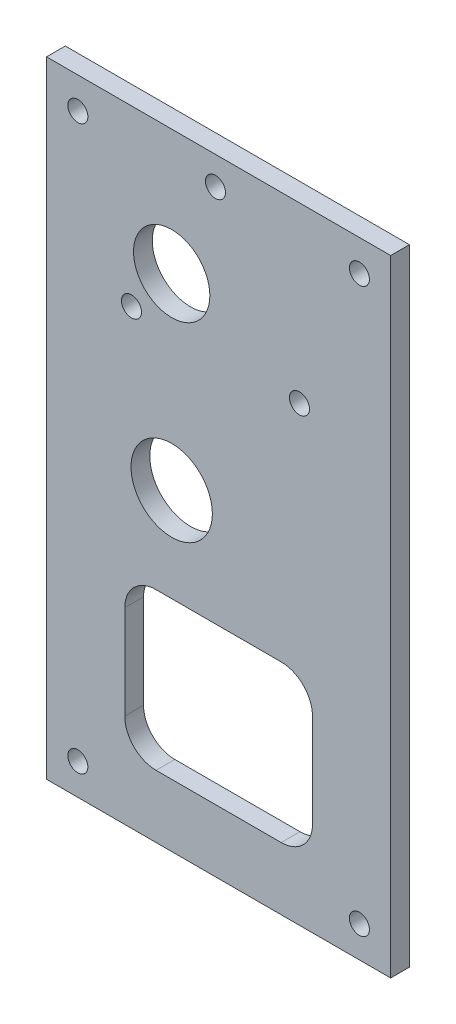
ISO-10303-21;
HEADER;
FILE_DESCRIPTION(('STEP AP214'),'2;1');
FILE_NAME('part.step','',(''),(''),'','','');
FILE_SCHEMA(('AUTOMOTIVE_DESIGN { 1 0 10303 214 1 1 1 1 }'));
ENDSEC;
DATA;
#1=APPLICATION_CONTEXT('core data for automotive mechanical design processes');
#2=APPLICATION_PROTOCOL_DEFINITION('international standard','automotive_design',2000,#1);
#3=PRODUCT_CONTEXT('',#1,'mechanical');
#4=PRODUCT('Part','Part','',(#3));
#5=PRODUCT_RELATED_PRODUCT_CATEGORY('part','',(#4));
#6=PRODUCT_DEFINITION_FORMATION('','',#4);
#7=PRODUCT_DEFINITION_CONTEXT('part definition',#1,'design');
#8=PRODUCT_DEFINITION('design','',#6,#7);
#9=PRODUCT_DEFINITION_SHAPE('','',#8);
#10=(LENGTH_UNIT() NAMED_UNIT(*) SI_UNIT(.MILLI.,.METRE.));
#11=(NAMED_UNIT(*) PLANE_ANGLE_UNIT() SI_UNIT($,.RADIAN.));
#12=(NAMED_UNIT(*) SI_UNIT($,.STERADIAN.) SOLID_ANGLE_UNIT());
#13=UNCERTAINTY_MEASURE_WITH_UNIT(LENGTH_MEASURE(1.E-05),#10,'distance_accuracy_value','');
#14=(GEOMETRIC_REPRESENTATION_CONTEXT(3) GLOBAL_UNCERTAINTY_ASSIGNED_CONTEXT((#13)) GLOBAL_UNIT_ASSIGNED_CONTEXT((#10,
#11,#12)) REPRESENTATION_CONTEXT('',''));
#15=CARTESIAN_POINT('',(0.,0.,0.));
#16=DIRECTION('',(0.,0.,1.));
#17=DIRECTION('',(1.,0.,0.));
#18=AXIS2_PLACEMENT_3D('',#15,#16,#17);
#19=CARTESIAN_POINT('',(27.5,50.,1.5));
#20=DIRECTION('',(-1.,0.,0.));
#21=DIRECTION('',(0.,-1.,0.));
#22=AXIS2_PLACEMENT_3D('',#19,#20,#21);
#23=PLANE('',#22);
#24=DIRECTION('',(0.,1.,0.));
#25=VECTOR('',#24,1.);
#26=CARTESIAN_POINT('',(27.5,50.,-1.5));
#27=LINE('',#26,#25);
#28=CARTESIAN_POINT('',(27.5,-50.,-1.5));
#29=VERTEX_POINT('',#28);
#30=CARTESIAN_POINT('',(27.5,50.,-1.5));
#31=VERTEX_POINT('',#30);
#32=EDGE_CURVE('E154',#29,#31,#27,.T.);
#33=ORIENTED_EDGE('',*,*,#32,.T.);
#34=DIRECTION('',(0.,0.,-1.));
#35=VECTOR('',#34,1.);
#36=CARTESIAN_POINT('',(27.5,50.,1.5));
#37=LINE('',#36,#35);
#38=CARTESIAN_POINT('',(27.5,50.,1.5));
#39=VERTEX_POINT('',#38);
#40=EDGE_CURVE('E133',#39,#31,#37,.T.);
#41=ORIENTED_EDGE('',*,*,#40,.F.);
#42=DIRECTION('',(0.,1.,0.));
#43=VECTOR('',#42,1.);
#44=CARTESIAN_POINT('',(27.5,50.,1.5));
#45=LINE('',#44,#43);
#46=CARTESIAN_POINT('',(27.5,-50.,1.5));
#47=VERTEX_POINT('',#46);
#48=EDGE_CURVE('E141',#47,#39,#45,.T.);
#49=ORIENTED_EDGE('',*,*,#48,.F.);
#50=DIRECTION('',(0.,0.,-1.));
#51=VECTOR('',#50,1.);
#52=CARTESIAN_POINT('',(27.5,-50.,1.5));
#53=LINE('',#52,#51);
#54=EDGE_CURVE('E328',#47,#29,#53,.T.);
#55=ORIENTED_EDGE('',*,*,#54,.T.);
#56=EDGE_LOOP('',(#33,#41,#49,#55));
#57=FACE_BOUND('',#56,.T.);
#58=ADVANCED_FACE('F38',(#57),#23,.F.);
#59=CARTESIAN_POINT('',(-27.5,50.,1.5));
#60=DIRECTION('',(0.,-1.,0.));
#61=DIRECTION('',(0.,0.,-1.));
#62=AXIS2_PLACEMENT_3D('',#59,#60,#61);
#63=PLANE('',#62);
#64=DIRECTION('',(-1.,0.,0.));
#65=VECTOR('',#64,1.);
#66=CARTESIAN_POINT('',(-27.5,50.,-1.5));
#67=LINE('',#66,#65);
#68=CARTESIAN_POINT('',(-27.5,50.,-1.5));
#69=VERTEX_POINT('',#68);
#70=EDGE_CURVE('E331',#31,#69,#67,.T.);
#71=ORIENTED_EDGE('',*,*,#70,.T.);
#72=DIRECTION('',(0.,0.,-1.));
#73=VECTOR('',#72,1.);
#74=CARTESIAN_POINT('',(-27.5,50.,1.5));
#75=LINE('',#74,#73);
#76=CARTESIAN_POINT('',(-27.5,50.,1.5));
#77=VERTEX_POINT('',#76);
#78=EDGE_CURVE('E136',#77,#69,#75,.T.);
#79=ORIENTED_EDGE('',*,*,#78,.F.);
#80=DIRECTION('',(-1.,0.,0.));
#81=VECTOR('',#80,1.);
#82=CARTESIAN_POINT('',(-27.5,50.,1.5));
#83=LINE('',#82,#81);
#84=EDGE_CURVE('E129',#39,#77,#83,.T.);
#85=ORIENTED_EDGE('',*,*,#84,.F.);
#86=ORIENTED_EDGE('',*,*,#40,.T.);
#87=EDGE_LOOP('',(#71,#79,#85,#86));
#88=FACE_BOUND('',#87,.T.);
#89=ADVANCED_FACE('F131',(#88),#63,.F.);
#90=CARTESIAN_POINT('',(-27.5,50.,1.5));
#91=DIRECTION('',(1.,0.,0.));
#92=DIRECTION('',(0.,1.,0.));
#93=AXIS2_PLACEMENT_3D('',#90,#91,#92);
#94=PLANE('',#93);
#95=DIRECTION('',(0.,-1.,0.));
#96=VECTOR('',#95,1.);
#97=CARTESIAN_POINT('',(-27.5,50.,-1.5));
#98=LINE('',#97,#96);
#99=CARTESIAN_POINT('',(-27.5,-50.,-1.5));
#100=VERTEX_POINT('',#99);
#101=EDGE_CURVE('E334',#69,#100,#98,.T.);
#102=ORIENTED_EDGE('',*,*,#101,.T.);
#103=DIRECTION('',(0.,0.,-1.));
#104=VECTOR('',#103,1.);
#105=CARTESIAN_POINT('',(-27.5,-50.,1.5));
#106=LINE('',#105,#104);
#107=CARTESIAN_POINT('',(-27.5,-50.,1.5));
#108=VERTEX_POINT('',#107);
#109=EDGE_CURVE('E162',#108,#100,#106,.T.);
#110=ORIENTED_EDGE('',*,*,#109,.F.);
#111=DIRECTION('',(0.,-1.,0.));
#112=VECTOR('',#111,1.);
#113=CARTESIAN_POINT('',(-27.5,50.,1.5));
#114=LINE('',#113,#112);
#115=EDGE_CURVE('E140',#77,#108,#114,.T.);
#116=ORIENTED_EDGE('',*,*,#115,.F.);
#117=ORIENTED_EDGE('',*,*,#78,.T.);
#118=EDGE_LOOP('',(#102,#110,#116,#117));
#119=FACE_BOUND('',#118,.T.);
#120=ADVANCED_FACE('F349',(#119),#94,.F.);
#121=CARTESIAN_POINT('',(-27.5,-50.,1.5));
#122=DIRECTION('',(0.,1.,0.));
#123=DIRECTION('',(0.,0.,1.));
#124=AXIS2_PLACEMENT_3D('',#121,#122,#123);
#125=PLANE('',#124);
#126=DIRECTION('',(1.,0.,0.));
#127=VECTOR('',#126,1.);
#128=CARTESIAN_POINT('',(-27.5,-50.,-1.5));
#129=LINE('',#128,#127);
#130=EDGE_CURVE('E151',#100,#29,#129,.T.);
#131=ORIENTED_EDGE('',*,*,#130,.T.);
#132=ORIENTED_EDGE('',*,*,#54,.F.);
#133=DIRECTION('',(1.,0.,0.));
#134=VECTOR('',#133,1.);
#135=CARTESIAN_POINT('',(-27.5,-50.,1.5));
#136=LINE('',#135,#134);
#137=EDGE_CURVE('E146',#108,#47,#136,.T.);
#138=ORIENTED_EDGE('',*,*,#137,.F.);
#139=ORIENTED_EDGE('',*,*,#109,.T.);
#140=EDGE_LOOP('',(#131,#132,#138,#139));
#141=FACE_BOUND('',#140,.T.);
#142=ADVANCED_FACE('F345',(#141),#125,.F.);
#143=CARTESIAN_POINT('',(0.,0.,1.5));
#144=DIRECTION('',(0.,0.,1.));
#145=DIRECTION('',(1.,0.,0.));
#146=AXIS2_PLACEMENT_3D('',#143,#144,#145);
#147=PLANE('',#146);
#148=DIRECTION('',(0.,1.,0.));
#149=VECTOR('',#148,1.);
#150=CARTESIAN_POINT('',(15.,-15.,1.5));
#151=LINE('',#150,#149);
#152=CARTESIAN_POINT('',(15.,-35.,1.5));
#153=VERTEX_POINT('',#152);
#154=CARTESIAN_POINT('',(15.,-20.,1.5));
#155=VERTEX_POINT('',#154);
#156=EDGE_CURVE('E219',#153,#155,#151,.T.);
#157=ORIENTED_EDGE('',*,*,#156,.F.);
#158=CARTESIAN_POINT('',(9.99999999999999,-35.,1.5));
#159=DIRECTION('',(0.,0.,1.));
#160=DIRECTION('',(1.,0.,0.));
#161=AXIS2_PLACEMENT_3D('',#158,#159,#160);
#162=CIRCLE('',#161,5.);
#163=CARTESIAN_POINT('',(9.99999999999999,-40.,1.5));
#164=VERTEX_POINT('',#163);
#165=EDGE_CURVE('E189',#153,#164,#162,.F.);
#166=ORIENTED_EDGE('',*,*,#165,.T.);
#167=DIRECTION('',(1.,0.,0.));
#168=VECTOR('',#167,1.);
#169=CARTESIAN_POINT('',(-15.,-40.,1.5));
#170=LINE('',#169,#168);
#171=CARTESIAN_POINT('',(-10.,-40.,1.5));
#172=VERTEX_POINT('',#171);
#173=EDGE_CURVE('E249',#172,#164,#170,.T.);
#174=ORIENTED_EDGE('',*,*,#173,.F.);
#175=CARTESIAN_POINT('',(-10.,-35.,1.5));
#176=DIRECTION('',(0.,0.,1.));
#177=DIRECTION('',(1.,0.,0.));
#178=AXIS2_PLACEMENT_3D('',#175,#176,#177);
#179=CIRCLE('',#178,5.);
#180=CARTESIAN_POINT('',(-15.,-35.,1.5));
#181=VERTEX_POINT('',#180);
#182=EDGE_CURVE('E195',#172,#181,#179,.F.);
#183=ORIENTED_EDGE('',*,*,#182,.T.);
#184=DIRECTION('',(0.,-1.,0.));
#185=VECTOR('',#184,1.);
#186=CARTESIAN_POINT('',(-15.,-15.,1.5));
#187=LINE('',#186,#185);
#188=CARTESIAN_POINT('',(-15.,-20.,1.5));
#189=VERTEX_POINT('',#188);
#190=EDGE_CURVE('E213',#189,#181,#187,.T.);
#191=ORIENTED_EDGE('',*,*,#190,.F.);
#192=CARTESIAN_POINT('',(-10.,-20.,1.5));
#193=DIRECTION('',(0.,0.,1.));
#194=DIRECTION('',(1.,0.,0.));
#195=AXIS2_PLACEMENT_3D('',#192,#193,#194);
#196=CIRCLE('',#195,5.);
#197=CARTESIAN_POINT('',(-10.,-15.,1.5));
#198=VERTEX_POINT('',#197);
#199=EDGE_CURVE('E47',#189,#198,#196,.F.);
#200=ORIENTED_EDGE('',*,*,#199,.T.);
#201=DIRECTION('',(-1.,0.,0.));
#202=VECTOR('',#201,1.);
#203=CARTESIAN_POINT('',(-15.,-15.,1.5));
#204=LINE('',#203,#202);
#205=CARTESIAN_POINT('',(9.99999999999999,-15.,1.5));
#206=VERTEX_POINT('',#205);
#207=EDGE_CURVE('E211',#206,#198,#204,.T.);
#208=ORIENTED_EDGE('',*,*,#207,.F.);
#209=CARTESIAN_POINT('',(9.99999999999999,-20.,1.5));
#210=DIRECTION('',(0.,0.,1.));
#211=DIRECTION('',(1.,0.,0.));
#212=AXIS2_PLACEMENT_3D('',#209,#210,#211);
#213=CIRCLE('',#212,5.);
#214=EDGE_CURVE('E201',#206,#155,#213,.F.);
#215=ORIENTED_EDGE('',*,*,#214,.T.);
#216=EDGE_LOOP('',(#157,#166,#174,#183,#191,#200,#208,#215));
#217=FACE_BOUND('',#216,.T.);
#218=CARTESIAN_POINT('',(-22.5,-45.,1.5));
#219=DIRECTION('',(0.,0.,1.));
#220=DIRECTION('',(-1.,0.,0.));
#221=AXIS2_PLACEMENT_3D('',#218,#219,#220);
#222=CIRCLE('',#221,1.6);
#223=CARTESIAN_POINT('',(-24.1,-45.,1.5));
#224=VERTEX_POINT('',#223);
#225=EDGE_CURVE('E238',#224,#224,#222,.T.);
#226=ORIENTED_EDGE('',*,*,#225,.F.);
#227=EDGE_LOOP('',(#226));
#228=FACE_BOUND('',#227,.T.);
#229=CARTESIAN_POINT('',(22.5,-45.,1.5));
#230=DIRECTION('',(0.,0.,1.));
#231=DIRECTION('',(1.,0.,0.));
#232=AXIS2_PLACEMENT_3D('',#229,#230,#231);
#233=CIRCLE('',#232,1.6);
#234=CARTESIAN_POINT('',(24.1,-45.,1.5));
#235=VERTEX_POINT('',#234);
#236=EDGE_CURVE('E266',#235,#235,#233,.T.);
#237=ORIENTED_EDGE('',*,*,#236,.F.);
#238=EDGE_LOOP('',(#237));
#239=FACE_BOUND('',#238,.T.);
#240=CARTESIAN_POINT('',(22.5,45.,1.5));
#241=DIRECTION('',(0.,0.,1.));
#242=DIRECTION('',(-1.,0.,0.));
#243=AXIS2_PLACEMENT_3D('',#240,#241,#242);
#244=CIRCLE('',#243,1.6);
#245=CARTESIAN_POINT('',(20.9,45.,1.5));
#246=VERTEX_POINT('',#245);
#247=EDGE_CURVE('E258',#246,#246,#244,.T.);
#248=ORIENTED_EDGE('',*,*,#247,.F.);
#249=EDGE_LOOP('',(#248));
#250=FACE_BOUND('',#249,.T.);
#251=CARTESIAN_POINT('',(-22.5,45.,1.5));
#252=DIRECTION('',(0.,0.,1.));
#253=DIRECTION('',(1.,0.,0.));
#254=AXIS2_PLACEMENT_3D('',#251,#252,#253);
#255=CIRCLE('',#254,1.6);
#256=CARTESIAN_POINT('',(-20.9,45.,1.5));
#257=VERTEX_POINT('',#256);
#258=EDGE_CURVE('E257',#257,#257,#255,.T.);
#259=ORIENTED_EDGE('',*,*,#258,.F.);
#260=EDGE_LOOP('',(#259));
#261=FACE_BOUND('',#260,.T.);
#262=CARTESIAN_POINT('',(-7.5,0.,1.5));
#263=DIRECTION('',(0.,0.,1.));
#264=DIRECTION('',(1.,0.,0.));
#265=AXIS2_PLACEMENT_3D('',#262,#263,#264);
#266=CIRCLE('',#265,6.5);
#267=CARTESIAN_POINT('',(-0.999999999999998,0.,1.5));
#268=VERTEX_POINT('',#267);
#269=EDGE_CURVE('E301',#268,#268,#266,.T.);
#270=ORIENTED_EDGE('',*,*,#269,.F.);
#271=EDGE_LOOP('',(#270));
#272=FACE_BOUND('',#271,.T.);
#273=CARTESIAN_POINT('',(12.9233937586588,22.25,1.5));
#274=DIRECTION('',(0.,0.,1.));
#275=DIRECTION('',(1.,0.,0.));
#276=AXIS2_PLACEMENT_3D('',#273,#274,#275);
#277=CIRCLE('',#276,1.6);
#278=CARTESIAN_POINT('',(14.5233937586588,22.25,1.5));
#279=VERTEX_POINT('',#278);
#280=EDGE_CURVE('E310',#279,#279,#277,.T.);
#281=ORIENTED_EDGE('',*,*,#280,.F.);
#282=EDGE_LOOP('',(#281));
#283=FACE_BOUND('',#282,.T.);
#284=CARTESIAN_POINT('',(-0.500000000000006,45.5,1.5));
#285=DIRECTION('',(0.,0.,1.));
#286=DIRECTION('',(1.,0.,0.));
#287=AXIS2_PLACEMENT_3D('',#284,#285,#286);
#288=CIRCLE('',#287,1.6);
#289=CARTESIAN_POINT('',(1.09999999999999,45.5,1.5));
#290=VERTEX_POINT('',#289);
#291=EDGE_CURVE('E285',#290,#290,#288,.T.);
#292=ORIENTED_EDGE('',*,*,#291,.F.);
#293=EDGE_LOOP('',(#292));
#294=FACE_BOUND('',#293,.T.);
#295=CARTESIAN_POINT('',(-13.9233937586588,22.25,1.5));
#296=DIRECTION('',(0.,0.,1.));
#297=DIRECTION('',(1.,0.,0.));
#298=AXIS2_PLACEMENT_3D('',#295,#296,#297);
#299=CIRCLE('',#298,1.6);
#300=CARTESIAN_POINT('',(-12.3233937586588,22.25,1.5));
#301=VERTEX_POINT('',#300);
#302=EDGE_CURVE('E294',#301,#301,#299,.T.);
#303=ORIENTED_EDGE('',*,*,#302,.F.);
#304=EDGE_LOOP('',(#303));
#305=FACE_BOUND('',#304,.T.);
#306=CARTESIAN_POINT('',(-7.5,30.,1.5));
#307=DIRECTION('',(0.,0.,1.));
#308=DIRECTION('',(1.,0.,0.));
#309=AXIS2_PLACEMENT_3D('',#306,#307,#308);
#310=CIRCLE('',#309,6.1);
#311=CARTESIAN_POINT('',(-1.4,30.,1.5));
#312=VERTEX_POINT('',#311);
#313=EDGE_CURVE('E305',#312,#312,#310,.T.);
#314=ORIENTED_EDGE('',*,*,#313,.F.);
#315=EDGE_LOOP('',(#314));
#316=FACE_BOUND('',#315,.T.);
#317=ORIENTED_EDGE('',*,*,#48,.T.);
#318=ORIENTED_EDGE('',*,*,#84,.T.);
#319=ORIENTED_EDGE('',*,*,#115,.T.);
#320=ORIENTED_EDGE('',*,*,#137,.T.);
#321=EDGE_LOOP('',(#317,#318,#319,#320));
#322=FACE_BOUND('',#321,.T.);
#323=ADVANCED_FACE('F144',(#217,#228,#239,#250,#261,#272,#283,#294,#305,#316,#322),#147,.T.);
#324=CARTESIAN_POINT('',(0.,0.,-1.5));
#325=DIRECTION('',(0.,0.,1.));
#326=DIRECTION('',(1.,0.,0.));
#327=AXIS2_PLACEMENT_3D('',#324,#325,#326);
#328=PLANE('',#327);
#329=DIRECTION('',(0.,-1.,0.));
#330=VECTOR('',#329,1.);
#331=CARTESIAN_POINT('',(-15.,-15.,-1.5));
#332=LINE('',#331,#330);
#333=CARTESIAN_POINT('',(-15.,-20.,-1.5));
#334=VERTEX_POINT('',#333);
#335=CARTESIAN_POINT('',(-15.,-35.,-1.5));
#336=VERTEX_POINT('',#335);
#337=EDGE_CURVE('E226',#334,#336,#332,.T.);
#338=ORIENTED_EDGE('',*,*,#337,.T.);
#339=CARTESIAN_POINT('',(-10.,-35.,-1.5));
#340=DIRECTION('',(0.,0.,1.));
#341=DIRECTION('',(1.,0.,0.));
#342=AXIS2_PLACEMENT_3D('',#339,#340,#341);
#343=CIRCLE('',#342,5.);
#344=CARTESIAN_POINT('',(-10.,-40.,-1.5));
#345=VERTEX_POINT('',#344);
#346=EDGE_CURVE('E198',#336,#345,#343,.T.);
#347=ORIENTED_EDGE('',*,*,#346,.T.);
#348=DIRECTION('',(1.,0.,0.));
#349=VECTOR('',#348,1.);
#350=CARTESIAN_POINT('',(-15.,-40.,-1.5));
#351=LINE('',#350,#349);
#352=CARTESIAN_POINT('',(9.99999999999999,-40.,-1.5));
#353=VERTEX_POINT('',#352);
#354=EDGE_CURVE('E233',#345,#353,#351,.T.);
#355=ORIENTED_EDGE('',*,*,#354,.T.);
#356=CARTESIAN_POINT('',(9.99999999999999,-35.,-1.5));
#357=DIRECTION('',(0.,0.,1.));
#358=DIRECTION('',(1.,0.,0.));
#359=AXIS2_PLACEMENT_3D('',#356,#357,#358);
#360=CIRCLE('',#359,5.);
#361=CARTESIAN_POINT('',(15.,-35.,-1.5));
#362=VERTEX_POINT('',#361);
#363=EDGE_CURVE('E192',#353,#362,#360,.T.);
#364=ORIENTED_EDGE('',*,*,#363,.T.);
#365=DIRECTION('',(0.,1.,0.));
#366=VECTOR('',#365,1.);
#367=CARTESIAN_POINT('',(15.,-15.,-1.5));
#368=LINE('',#367,#366);
#369=CARTESIAN_POINT('',(15.,-20.,-1.5));
#370=VERTEX_POINT('',#369);
#371=EDGE_CURVE('E240',#362,#370,#368,.T.);
#372=ORIENTED_EDGE('',*,*,#371,.T.);
#373=CARTESIAN_POINT('',(9.99999999999999,-20.,-1.5));
#374=DIRECTION('',(0.,0.,1.));
#375=DIRECTION('',(1.,0.,0.));
#376=AXIS2_PLACEMENT_3D('',#373,#374,#375);
#377=CIRCLE('',#376,5.);
#378=CARTESIAN_POINT('',(9.99999999999999,-15.,-1.5));
#379=VERTEX_POINT('',#378);
#380=EDGE_CURVE('E61',#370,#379,#377,.T.);
#381=ORIENTED_EDGE('',*,*,#380,.T.);
#382=DIRECTION('',(-1.,0.,0.));
#383=VECTOR('',#382,1.);
#384=CARTESIAN_POINT('',(-15.,-15.,-1.5));
#385=LINE('',#384,#383);
#386=CARTESIAN_POINT('',(-10.,-15.,-1.5));
#387=VERTEX_POINT('',#386);
#388=EDGE_CURVE('E228',#379,#387,#385,.T.);
#389=ORIENTED_EDGE('',*,*,#388,.T.);
#390=CARTESIAN_POINT('',(-10.,-20.,-1.5));
#391=DIRECTION('',(0.,0.,1.));
#392=DIRECTION('',(1.,0.,0.));
#393=AXIS2_PLACEMENT_3D('',#390,#391,#392);
#394=CIRCLE('',#393,5.);
#395=EDGE_CURVE('E11',#387,#334,#394,.T.);
#396=ORIENTED_EDGE('',*,*,#395,.T.);
#397=EDGE_LOOP('',(#338,#347,#355,#364,#372,#381,#389,#396));
#398=FACE_BOUND('',#397,.T.);
#399=CARTESIAN_POINT('',(-22.5,-45.,-1.5));
#400=DIRECTION('',(0.,0.,1.));
#401=DIRECTION('',(-1.,0.,0.));
#402=AXIS2_PLACEMENT_3D('',#399,#400,#401);
#403=CIRCLE('',#402,1.6);
#404=CARTESIAN_POINT('',(-24.1,-45.,-1.5));
#405=VERTEX_POINT('',#404);
#406=EDGE_CURVE('E270',#405,#405,#403,.T.);
#407=ORIENTED_EDGE('',*,*,#406,.T.);
#408=EDGE_LOOP('',(#407));
#409=FACE_BOUND('',#408,.T.);
#410=CARTESIAN_POINT('',(22.5,-45.,-1.5));
#411=DIRECTION('',(0.,0.,1.));
#412=DIRECTION('',(1.,0.,0.));
#413=AXIS2_PLACEMENT_3D('',#410,#411,#412);
#414=CIRCLE('',#413,1.6);
#415=CARTESIAN_POINT('',(24.1,-45.,-1.5));
#416=VERTEX_POINT('',#415);
#417=EDGE_CURVE('E262',#416,#416,#414,.T.);
#418=ORIENTED_EDGE('',*,*,#417,.T.);
#419=EDGE_LOOP('',(#418));
#420=FACE_BOUND('',#419,.T.);
#421=CARTESIAN_POINT('',(22.5,45.,-1.5));
#422=DIRECTION('',(0.,0.,1.));
#423=DIRECTION('',(-1.,0.,0.));
#424=AXIS2_PLACEMENT_3D('',#421,#422,#423);
#425=CIRCLE('',#424,1.6);
#426=CARTESIAN_POINT('',(20.9,45.,-1.5));
#427=VERTEX_POINT('',#426);
#428=EDGE_CURVE('E253',#427,#427,#425,.T.);
#429=ORIENTED_EDGE('',*,*,#428,.T.);
#430=EDGE_LOOP('',(#429));
#431=FACE_BOUND('',#430,.T.);
#432=CARTESIAN_POINT('',(-22.5,45.,-1.5));
#433=DIRECTION('',(0.,0.,1.));
#434=DIRECTION('',(1.,0.,0.));
#435=AXIS2_PLACEMENT_3D('',#432,#433,#434);
#436=CIRCLE('',#435,1.6);
#437=CARTESIAN_POINT('',(-20.9,45.,-1.5));
#438=VERTEX_POINT('',#437);
#439=EDGE_CURVE('E277',#438,#438,#436,.T.);
#440=ORIENTED_EDGE('',*,*,#439,.T.);
#441=EDGE_LOOP('',(#440));
#442=FACE_BOUND('',#441,.T.);
#443=CARTESIAN_POINT('',(-7.5,0.,-1.5));
#444=DIRECTION('',(0.,0.,1.));
#445=DIRECTION('',(1.,0.,0.));
#446=AXIS2_PLACEMENT_3D('',#443,#444,#445);
#447=CIRCLE('',#446,6.5);
#448=CARTESIAN_POINT('',(-0.999999999999998,0.,-1.5));
#449=VERTEX_POINT('',#448);
#450=EDGE_CURVE('E306',#449,#449,#447,.T.);
#451=ORIENTED_EDGE('',*,*,#450,.T.);
#452=EDGE_LOOP('',(#451));
#453=FACE_BOUND('',#452,.T.);
#454=CARTESIAN_POINT('',(12.9233937586588,22.25,-1.5));
#455=DIRECTION('',(0.,0.,1.));
#456=DIRECTION('',(1.,0.,0.));
#457=AXIS2_PLACEMENT_3D('',#454,#455,#456);
#458=CIRCLE('',#457,1.6);
#459=CARTESIAN_POINT('',(14.5233937586588,22.25,-1.5));
#460=VERTEX_POINT('',#459);
#461=EDGE_CURVE('E289',#460,#460,#458,.T.);
#462=ORIENTED_EDGE('',*,*,#461,.T.);
#463=EDGE_LOOP('',(#462));
#464=FACE_BOUND('',#463,.T.);
#465=CARTESIAN_POINT('',(-0.500000000000006,45.5,-1.5));
#466=DIRECTION('',(0.,0.,1.));
#467=DIRECTION('',(1.,0.,0.));
#468=AXIS2_PLACEMENT_3D('',#465,#466,#467);
#469=CIRCLE('',#468,1.6);
#470=CARTESIAN_POINT('',(1.09999999999999,45.5,-1.5));
#471=VERTEX_POINT('',#470);
#472=EDGE_CURVE('E290',#471,#471,#469,.T.);
#473=ORIENTED_EDGE('',*,*,#472,.T.);
#474=EDGE_LOOP('',(#473));
#475=FACE_BOUND('',#474,.T.);
#476=CARTESIAN_POINT('',(-13.9233937586588,22.25,-1.5));
#477=DIRECTION('',(0.,0.,1.));
#478=DIRECTION('',(1.,0.,0.));
#479=AXIS2_PLACEMENT_3D('',#476,#477,#478);
#480=CIRCLE('',#479,1.6);
#481=CARTESIAN_POINT('',(-12.3233937586588,22.25,-1.5));
#482=VERTEX_POINT('',#481);
#483=EDGE_CURVE('E281',#482,#482,#480,.T.);
#484=ORIENTED_EDGE('',*,*,#483,.T.);
#485=EDGE_LOOP('',(#484));
#486=FACE_BOUND('',#485,.T.);
#487=CARTESIAN_POINT('',(-7.5,30.,-1.5));
#488=DIRECTION('',(0.,0.,1.));
#489=DIRECTION('',(1.,0.,0.));
#490=AXIS2_PLACEMENT_3D('',#487,#488,#489);
#491=CIRCLE('',#490,6.1);
#492=CARTESIAN_POINT('',(-1.4,30.,-1.5));
#493=VERTEX_POINT('',#492);
#494=EDGE_CURVE('E317',#493,#493,#491,.T.);
#495=ORIENTED_EDGE('',*,*,#494,.T.);
#496=EDGE_LOOP('',(#495));
#497=FACE_BOUND('',#496,.T.);
#498=ORIENTED_EDGE('',*,*,#32,.F.);
#499=ORIENTED_EDGE('',*,*,#130,.F.);
#500=ORIENTED_EDGE('',*,*,#101,.F.);
#501=ORIENTED_EDGE('',*,*,#70,.F.);
#502=EDGE_LOOP('',(#498,#499,#500,#501));
#503=FACE_BOUND('',#502,.T.);
#504=ADVANCED_FACE('F224',(#398,#409,#420,#431,#442,#453,#464,#475,#486,#497,#503),#328,.F.);
#505=CARTESIAN_POINT('',(-7.5,30.,-1.5));
#506=DIRECTION('',(0.,0.,1.));
#507=DIRECTION('',(1.,0.,0.));
#508=AXIS2_PLACEMENT_3D('',#505,#506,#507);
#509=CYLINDRICAL_SURFACE('',#508,6.1);
#510=ORIENTED_EDGE('',*,*,#494,.F.);
#511=EDGE_LOOP('',(#510));
#512=FACE_BOUND('',#511,.T.);
#513=ORIENTED_EDGE('',*,*,#313,.T.);
#514=EDGE_LOOP('',(#513));
#515=FACE_BOUND('',#514,.T.);
#516=ADVANCED_FACE('F425',(#512,#515),#509,.F.);
#517=CARTESIAN_POINT('',(-13.9233937586588,22.25,-1.5));
#518=DIRECTION('',(0.,0.,1.));
#519=DIRECTION('',(1.,0.,0.));
#520=AXIS2_PLACEMENT_3D('',#517,#518,#519);
#521=CYLINDRICAL_SURFACE('',#520,1.6);
#522=ORIENTED_EDGE('',*,*,#483,.F.);
#523=EDGE_LOOP('',(#522));
#524=FACE_BOUND('',#523,.T.);
#525=ORIENTED_EDGE('',*,*,#302,.T.);
#526=EDGE_LOOP('',(#525));
#527=FACE_BOUND('',#526,.T.);
#528=ADVANCED_FACE('F421',(#524,#527),#521,.F.);
#529=CARTESIAN_POINT('',(-0.500000000000006,45.5,-1.5));
#530=DIRECTION('',(0.,0.,1.));
#531=DIRECTION('',(1.,0.,0.));
#532=AXIS2_PLACEMENT_3D('',#529,#530,#531);
#533=CYLINDRICAL_SURFACE('',#532,1.6);
#534=ORIENTED_EDGE('',*,*,#472,.F.);
#535=EDGE_LOOP('',(#534));
#536=FACE_BOUND('',#535,.T.);
#537=ORIENTED_EDGE('',*,*,#291,.T.);
#538=EDGE_LOOP('',(#537));
#539=FACE_BOUND('',#538,.T.);
#540=ADVANCED_FACE('F417',(#536,#539),#533,.F.);
#541=CARTESIAN_POINT('',(12.9233937586588,22.25,-1.5));
#542=DIRECTION('',(0.,0.,1.));
#543=DIRECTION('',(1.,0.,0.));
#544=AXIS2_PLACEMENT_3D('',#541,#542,#543);
#545=CYLINDRICAL_SURFACE('',#544,1.6);
#546=ORIENTED_EDGE('',*,*,#461,.F.);
#547=EDGE_LOOP('',(#546));
#548=FACE_BOUND('',#547,.T.);
#549=ORIENTED_EDGE('',*,*,#280,.T.);
#550=EDGE_LOOP('',(#549));
#551=FACE_BOUND('',#550,.T.);
#552=ADVANCED_FACE('F420',(#548,#551),#545,.F.);
#553=CARTESIAN_POINT('',(-7.5,0.,-1.5));
#554=DIRECTION('',(0.,0.,1.));
#555=DIRECTION('',(1.,0.,0.));
#556=AXIS2_PLACEMENT_3D('',#553,#554,#555);
#557=CYLINDRICAL_SURFACE('',#556,6.5);
#558=ORIENTED_EDGE('',*,*,#450,.F.);
#559=EDGE_LOOP('',(#558));
#560=FACE_BOUND('',#559,.T.);
#561=ORIENTED_EDGE('',*,*,#269,.T.);
#562=EDGE_LOOP('',(#561));
#563=FACE_BOUND('',#562,.T.);
#564=ADVANCED_FACE('F415',(#560,#563),#557,.F.);
#565=CARTESIAN_POINT('',(-22.5,45.,-1.5));
#566=DIRECTION('',(0.,0.,1.));
#567=DIRECTION('',(1.,0.,0.));
#568=AXIS2_PLACEMENT_3D('',#565,#566,#567);
#569=CYLINDRICAL_SURFACE('',#568,1.6);
#570=ORIENTED_EDGE('',*,*,#439,.F.);
#571=EDGE_LOOP('',(#570));
#572=FACE_BOUND('',#571,.T.);
#573=ORIENTED_EDGE('',*,*,#258,.T.);
#574=EDGE_LOOP('',(#573));
#575=FACE_BOUND('',#574,.T.);
#576=ADVANCED_FACE('F405',(#572,#575),#569,.F.);
#577=CARTESIAN_POINT('',(22.5,45.,-1.5));
#578=DIRECTION('',(0.,0.,1.));
#579=DIRECTION('',(1.,0.,0.));
#580=AXIS2_PLACEMENT_3D('',#577,#578,#579);
#581=CYLINDRICAL_SURFACE('',#580,1.6);
#582=ORIENTED_EDGE('',*,*,#428,.F.);
#583=EDGE_LOOP('',(#582));
#584=FACE_BOUND('',#583,.T.);
#585=ORIENTED_EDGE('',*,*,#247,.T.);
#586=EDGE_LOOP('',(#585));
#587=FACE_BOUND('',#586,.T.);
#588=ADVANCED_FACE('F401',(#584,#587),#581,.F.);
#589=CARTESIAN_POINT('',(22.5,-45.,-1.5));
#590=DIRECTION('',(0.,0.,1.));
#591=DIRECTION('',(1.,0.,0.));
#592=AXIS2_PLACEMENT_3D('',#589,#590,#591);
#593=CYLINDRICAL_SURFACE('',#592,1.6);
#594=ORIENTED_EDGE('',*,*,#417,.F.);
#595=EDGE_LOOP('',(#594));
#596=FACE_BOUND('',#595,.T.);
#597=ORIENTED_EDGE('',*,*,#236,.T.);
#598=EDGE_LOOP('',(#597));
#599=FACE_BOUND('',#598,.T.);
#600=ADVANCED_FACE('F404',(#596,#599),#593,.F.);
#601=CARTESIAN_POINT('',(-22.5,-45.,-1.5));
#602=DIRECTION('',(0.,0.,1.));
#603=DIRECTION('',(1.,0.,0.));
#604=AXIS2_PLACEMENT_3D('',#601,#602,#603);
#605=CYLINDRICAL_SURFACE('',#604,1.6);
#606=ORIENTED_EDGE('',*,*,#406,.F.);
#607=EDGE_LOOP('',(#606));
#608=FACE_BOUND('',#607,.T.);
#609=ORIENTED_EDGE('',*,*,#225,.T.);
#610=EDGE_LOOP('',(#609));
#611=FACE_BOUND('',#610,.T.);
#612=ADVANCED_FACE('F396',(#608,#611),#605,.F.);
#613=CARTESIAN_POINT('',(15.,-15.,-1.5));
#614=DIRECTION('',(1.,0.,0.));
#615=DIRECTION('',(0.,1.,0.));
#616=AXIS2_PLACEMENT_3D('',#613,#614,#615);
#617=PLANE('',#616);
#618=ORIENTED_EDGE('',*,*,#371,.F.);
#619=DIRECTION('',(0.,0.,1.));
#620=VECTOR('',#619,1.);
#621=CARTESIAN_POINT('',(15.,-35.,1.5));
#622=LINE('',#621,#620);
#623=EDGE_CURVE('E160',#362,#153,#622,.T.);
#624=ORIENTED_EDGE('',*,*,#623,.T.);
#625=ORIENTED_EDGE('',*,*,#156,.T.);
#626=DIRECTION('',(0.,0.,1.));
#627=VECTOR('',#626,1.);
#628=CARTESIAN_POINT('',(15.,-20.,-1.5));
#629=LINE('',#628,#627);
#630=EDGE_CURVE('E156',#155,#370,#629,.F.);
#631=ORIENTED_EDGE('',*,*,#630,.T.);
#632=EDGE_LOOP('',(#618,#624,#625,#631));
#633=FACE_BOUND('',#632,.T.);
#634=ADVANCED_FACE('F379',(#633),#617,.F.);
#635=CARTESIAN_POINT('',(-15.,-40.,-1.5));
#636=DIRECTION('',(0.,-1.,0.));
#637=DIRECTION('',(0.,0.,-1.));
#638=AXIS2_PLACEMENT_3D('',#635,#636,#637);
#639=PLANE('',#638);
#640=ORIENTED_EDGE('',*,*,#173,.T.);
#641=DIRECTION('',(0.,0.,1.));
#642=VECTOR('',#641,1.);
#643=CARTESIAN_POINT('',(9.99999999999999,-40.,-1.5));
#644=LINE('',#643,#642);
#645=EDGE_CURVE('E173',#164,#353,#644,.F.);
#646=ORIENTED_EDGE('',*,*,#645,.T.);
#647=ORIENTED_EDGE('',*,*,#354,.F.);
#648=DIRECTION('',(0.,0.,1.));
#649=VECTOR('',#648,1.);
#650=CARTESIAN_POINT('',(-10.,-40.,1.5));
#651=LINE('',#650,#649);
#652=EDGE_CURVE('E169',#345,#172,#651,.T.);
#653=ORIENTED_EDGE('',*,*,#652,.T.);
#654=EDGE_LOOP('',(#640,#646,#647,#653));
#655=FACE_BOUND('',#654,.T.);
#656=ADVANCED_FACE('F385',(#655),#639,.F.);
#657=CARTESIAN_POINT('',(-15.,-15.,-1.5));
#658=DIRECTION('',(-1.,0.,0.));
#659=DIRECTION('',(0.,-1.,0.));
#660=AXIS2_PLACEMENT_3D('',#657,#658,#659);
#661=PLANE('',#660);
#662=ORIENTED_EDGE('',*,*,#190,.T.);
#663=DIRECTION('',(0.,0.,1.));
#664=VECTOR('',#663,1.);
#665=CARTESIAN_POINT('',(-15.,-35.,-1.5));
#666=LINE('',#665,#664);
#667=EDGE_CURVE('E180',#181,#336,#666,.F.);
#668=ORIENTED_EDGE('',*,*,#667,.T.);
#669=ORIENTED_EDGE('',*,*,#337,.F.);
#670=DIRECTION('',(0.,0.,1.));
#671=VECTOR('',#670,1.);
#672=CARTESIAN_POINT('',(-15.,-20.,1.5));
#673=LINE('',#672,#671);
#674=EDGE_CURVE('E176',#334,#189,#673,.T.);
#675=ORIENTED_EDGE('',*,*,#674,.T.);
#676=EDGE_LOOP('',(#662,#668,#669,#675));
#677=FACE_BOUND('',#676,.T.);
#678=ADVANCED_FACE('F230',(#677),#661,.F.);
#679=CARTESIAN_POINT('',(-15.,-15.,-1.5));
#680=DIRECTION('',(0.,1.,0.));
#681=DIRECTION('',(0.,0.,1.));
#682=AXIS2_PLACEMENT_3D('',#679,#680,#681);
#683=PLANE('',#682);
#684=ORIENTED_EDGE('',*,*,#388,.F.);
#685=DIRECTION('',(0.,0.,1.));
#686=VECTOR('',#685,1.);
#687=CARTESIAN_POINT('',(9.99999999999999,-15.,1.5));
#688=LINE('',#687,#686);
#689=EDGE_CURVE('E185',#379,#206,#688,.T.);
#690=ORIENTED_EDGE('',*,*,#689,.T.);
#691=ORIENTED_EDGE('',*,*,#207,.T.);
#692=DIRECTION('',(0.,0.,1.));
#693=VECTOR('',#692,1.);
#694=CARTESIAN_POINT('',(-10.,-15.,-1.5));
#695=LINE('',#694,#693);
#696=EDGE_CURVE('E54',#198,#387,#695,.F.);
#697=ORIENTED_EDGE('',*,*,#696,.T.);
#698=EDGE_LOOP('',(#684,#690,#691,#697));
#699=FACE_BOUND('',#698,.T.);
#700=ADVANCED_FACE('F216',(#699),#683,.F.);
#701=CARTESIAN_POINT('',(9.99999999999999,-35.,-1.5));
#702=DIRECTION('',(0.,0.,-1.));
#703=DIRECTION('',(-1.,0.,0.));
#704=AXIS2_PLACEMENT_3D('',#701,#702,#703);
#705=CYLINDRICAL_SURFACE('',#704,5.);
#706=ORIENTED_EDGE('',*,*,#363,.F.);
#707=ORIENTED_EDGE('',*,*,#645,.F.);
#708=ORIENTED_EDGE('',*,*,#165,.F.);
#709=ORIENTED_EDGE('',*,*,#623,.F.);
#710=EDGE_LOOP('',(#706,#707,#708,#709));
#711=FACE_BOUND('',#710,.T.);
#712=ADVANCED_FACE('F363',(#711),#705,.F.);
#713=CARTESIAN_POINT('',(-10.,-35.,-1.5));
#714=DIRECTION('',(0.,0.,-1.));
#715=DIRECTION('',(-1.,0.,0.));
#716=AXIS2_PLACEMENT_3D('',#713,#714,#715);
#717=CYLINDRICAL_SURFACE('',#716,5.);
#718=ORIENTED_EDGE('',*,*,#346,.F.);
#719=ORIENTED_EDGE('',*,*,#667,.F.);
#720=ORIENTED_EDGE('',*,*,#182,.F.);
#721=ORIENTED_EDGE('',*,*,#652,.F.);
#722=EDGE_LOOP('',(#718,#719,#720,#721));
#723=FACE_BOUND('',#722,.T.);
#724=ADVANCED_FACE('F366',(#723),#717,.F.);
#725=CARTESIAN_POINT('',(9.99999999999999,-20.,-1.5));
#726=DIRECTION('',(0.,0.,-1.));
#727=DIRECTION('',(-1.,0.,0.));
#728=AXIS2_PLACEMENT_3D('',#725,#726,#727);
#729=CYLINDRICAL_SURFACE('',#728,5.);
#730=ORIENTED_EDGE('',*,*,#380,.F.);
#731=ORIENTED_EDGE('',*,*,#630,.F.);
#732=ORIENTED_EDGE('',*,*,#214,.F.);
#733=ORIENTED_EDGE('',*,*,#689,.F.);
#734=EDGE_LOOP('',(#730,#731,#732,#733));
#735=FACE_BOUND('',#734,.T.);
#736=ADVANCED_FACE('F369',(#735),#729,.F.);
#737=CARTESIAN_POINT('',(-10.,-20.,-1.5));
#738=DIRECTION('',(0.,0.,-1.));
#739=DIRECTION('',(-1.,0.,0.));
#740=AXIS2_PLACEMENT_3D('',#737,#738,#739);
#741=CYLINDRICAL_SURFACE('',#740,5.);
#742=ORIENTED_EDGE('',*,*,#395,.F.);
#743=ORIENTED_EDGE('',*,*,#696,.F.);
#744=ORIENTED_EDGE('',*,*,#199,.F.);
#745=ORIENTED_EDGE('',*,*,#674,.F.);
#746=EDGE_LOOP('',(#742,#743,#744,#745));
#747=FACE_BOUND('',#746,.T.);
#748=ADVANCED_FACE('F40',(#747),#741,.F.);
#749=CLOSED_SHELL('',(#58,#89,#120,#142,#323,#504,#516,#528,#540,#552,#564,#576,#588,#600,#612,
#634,#656,#678,#700,#712,#724,#736,#748));
#750=MANIFOLD_SOLID_BREP('B2',#749);
#751=ADVANCED_BREP_SHAPE_REPRESENTATION('',(#18,#750),#14);
#752=SHAPE_DEFINITION_REPRESENTATION(#9,#751);
ENDSEC;
END-ISO-10303-21;
